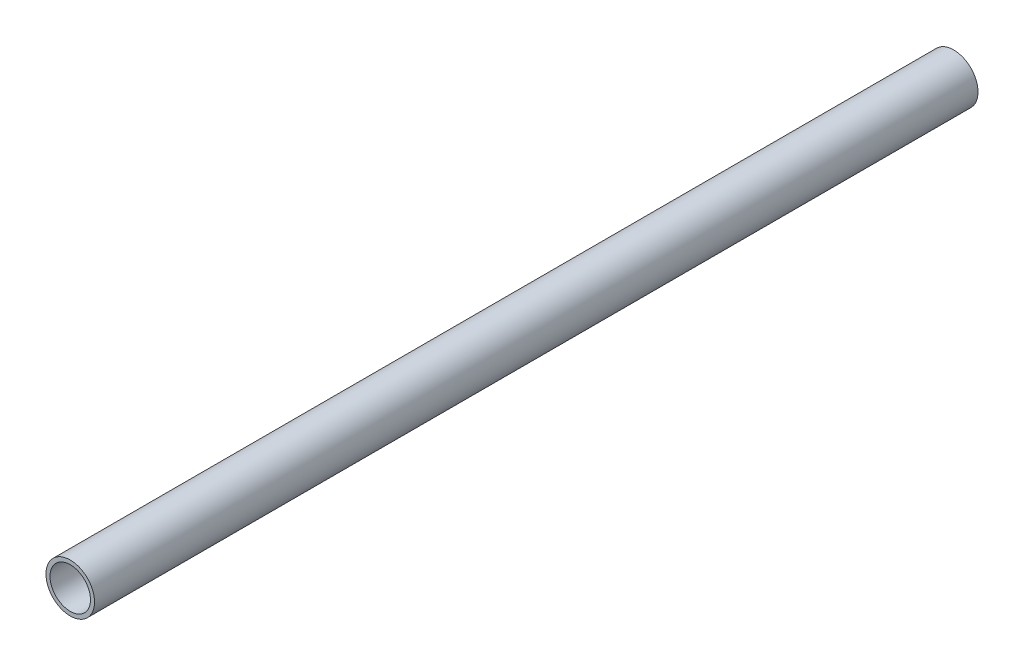
ISO-10303-21;
HEADER;
FILE_DESCRIPTION(('STEP AP214'),'2;1');
FILE_NAME('part.step','',(''),(''),'','','');
FILE_SCHEMA(('AUTOMOTIVE_DESIGN { 1 0 10303 214 1 1 1 1 }'));
ENDSEC;
DATA;
#1=APPLICATION_CONTEXT('core data for automotive mechanical design processes');
#2=APPLICATION_PROTOCOL_DEFINITION('international standard','automotive_design',2000,#1);
#3=PRODUCT_CONTEXT('',#1,'mechanical');
#4=PRODUCT('Part','Part','',(#3));
#5=PRODUCT_RELATED_PRODUCT_CATEGORY('part','',(#4));
#6=PRODUCT_DEFINITION_FORMATION('','',#4);
#7=PRODUCT_DEFINITION_CONTEXT('part definition',#1,'design');
#8=PRODUCT_DEFINITION('design','',#6,#7);
#9=PRODUCT_DEFINITION_SHAPE('','',#8);
#10=(LENGTH_UNIT() NAMED_UNIT(*) SI_UNIT(.MILLI.,.METRE.));
#11=(NAMED_UNIT(*) PLANE_ANGLE_UNIT() SI_UNIT($,.RADIAN.));
#12=(NAMED_UNIT(*) SI_UNIT($,.STERADIAN.) SOLID_ANGLE_UNIT());
#13=UNCERTAINTY_MEASURE_WITH_UNIT(LENGTH_MEASURE(1.E-05),#10,'distance_accuracy_value','');
#14=(GEOMETRIC_REPRESENTATION_CONTEXT(3) GLOBAL_UNCERTAINTY_ASSIGNED_CONTEXT((#13)) GLOBAL_UNIT_ASSIGNED_CONTEXT((#10,
#11,#12)) REPRESENTATION_CONTEXT('',''));
#15=CARTESIAN_POINT('',(0.,0.,0.));
#16=DIRECTION('',(0.,0.,1.));
#17=DIRECTION('',(1.,0.,0.));
#18=AXIS2_PLACEMENT_3D('',#15,#16,#17);
#19=CARTESIAN_POINT('',(0.,0.,655.));
#20=DIRECTION('',(0.,0.,1.));
#21=DIRECTION('',(1.,0.,0.));
#22=AXIS2_PLACEMENT_3D('',#19,#20,#21);
#23=PLANE('',#22);
#24=CARTESIAN_POINT('',(0.,0.,655.));
#25=DIRECTION('',(0.,0.,1.));
#26=DIRECTION('',(1.,0.,0.));
#27=AXIS2_PLACEMENT_3D('',#24,#25,#26);
#28=CIRCLE('',#27,18.);
#29=CARTESIAN_POINT('',(18.,0.,655.));
#30=VERTEX_POINT('',#29);
#31=EDGE_CURVE('E11',#30,#30,#28,.T.);
#32=ORIENTED_EDGE('',*,*,#31,.T.);
#33=EDGE_LOOP('',(#32));
#34=FACE_BOUND('',#33,.T.);
#35=CARTESIAN_POINT('',(0.,0.,655.));
#36=DIRECTION('',(0.,0.,1.));
#37=DIRECTION('',(1.,0.,0.));
#38=AXIS2_PLACEMENT_3D('',#35,#36,#37);
#39=CIRCLE('',#38,15.);
#40=CARTESIAN_POINT('',(15.,0.,655.));
#41=VERTEX_POINT('',#40);
#42=EDGE_CURVE('E48',#41,#41,#39,.T.);
#43=ORIENTED_EDGE('',*,*,#42,.F.);
#44=EDGE_LOOP('',(#43));
#45=FACE_BOUND('',#44,.T.);
#46=ADVANCED_FACE('F37',(#34,#45),#23,.T.);
#47=CARTESIAN_POINT('',(0.,0.,0.));
#48=DIRECTION('',(0.,0.,1.));
#49=DIRECTION('',(1.,0.,0.));
#50=AXIS2_PLACEMENT_3D('',#47,#48,#49);
#51=PLANE('',#50);
#52=CARTESIAN_POINT('',(0.,0.,0.));
#53=DIRECTION('',(0.,0.,1.));
#54=DIRECTION('',(1.,0.,0.));
#55=AXIS2_PLACEMENT_3D('',#52,#53,#54);
#56=CIRCLE('',#55,18.);
#57=CARTESIAN_POINT('',(18.,0.,0.));
#58=VERTEX_POINT('',#57);
#59=EDGE_CURVE('E41',#58,#58,#56,.T.);
#60=ORIENTED_EDGE('',*,*,#59,.F.);
#61=EDGE_LOOP('',(#60));
#62=FACE_BOUND('',#61,.T.);
#63=CARTESIAN_POINT('',(0.,0.,0.));
#64=DIRECTION('',(0.,0.,1.));
#65=DIRECTION('',(1.,0.,0.));
#66=AXIS2_PLACEMENT_3D('',#63,#64,#65);
#67=CIRCLE('',#66,15.);
#68=CARTESIAN_POINT('',(15.,0.,0.));
#69=VERTEX_POINT('',#68);
#70=EDGE_CURVE('E50',#69,#69,#67,.T.);
#71=ORIENTED_EDGE('',*,*,#70,.T.);
#72=EDGE_LOOP('',(#71));
#73=FACE_BOUND('',#72,.T.);
#74=ADVANCED_FACE('F60',(#62,#73),#51,.F.);
#75=CARTESIAN_POINT('',(0.,0.,655.));
#76=DIRECTION('',(0.,0.,-1.));
#77=DIRECTION('',(-1.,0.,0.));
#78=AXIS2_PLACEMENT_3D('',#75,#76,#77);
#79=CYLINDRICAL_SURFACE('',#78,18.);
#80=ORIENTED_EDGE('',*,*,#31,.F.);
#81=EDGE_LOOP('',(#80));
#82=FACE_BOUND('',#81,.T.);
#83=ORIENTED_EDGE('',*,*,#59,.T.);
#84=EDGE_LOOP('',(#83));
#85=FACE_BOUND('',#84,.T.);
#86=ADVANCED_FACE('F39',(#82,#85),#79,.T.);
#87=CARTESIAN_POINT('',(0.,0.,655.));
#88=DIRECTION('',(0.,0.,-1.));
#89=DIRECTION('',(-1.,0.,0.));
#90=AXIS2_PLACEMENT_3D('',#87,#88,#89);
#91=CYLINDRICAL_SURFACE('',#90,15.);
#92=ORIENTED_EDGE('',*,*,#42,.T.);
#93=EDGE_LOOP('',(#92));
#94=FACE_BOUND('',#93,.T.);
#95=ORIENTED_EDGE('',*,*,#70,.F.);
#96=EDGE_LOOP('',(#95));
#97=FACE_BOUND('',#96,.T.);
#98=ADVANCED_FACE('F56',(#94,#97),#91,.F.);
#99=CLOSED_SHELL('',(#46,#74,#86,#98));
#100=MANIFOLD_SOLID_BREP('B2',#99);
#101=ADVANCED_BREP_SHAPE_REPRESENTATION('',(#18,#100),#14);
#102=SHAPE_DEFINITION_REPRESENTATION(#9,#101);
ENDSEC;
END-ISO-10303-21;
